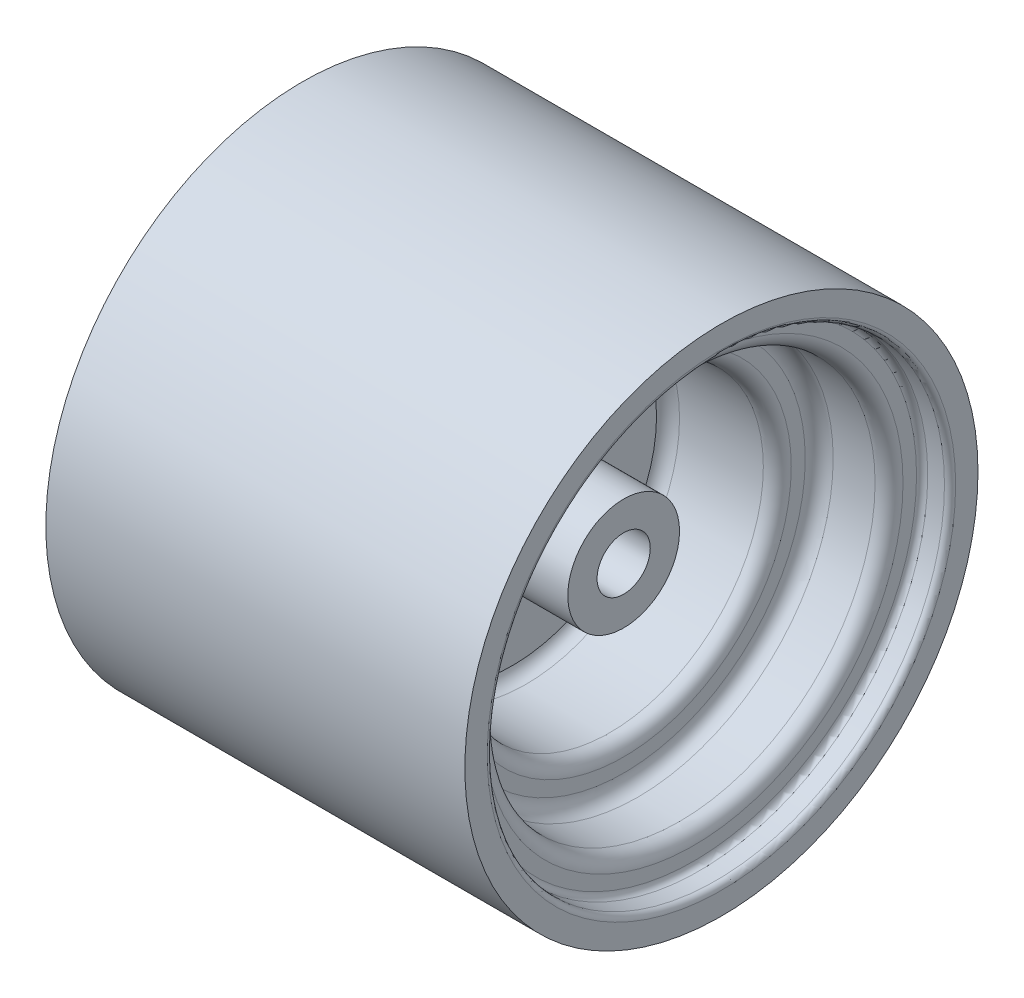
ISO-10303-21;
HEADER;
FILE_DESCRIPTION(('STEP AP214'),'2;1');
FILE_NAME('part.step','',(''),(''),'','','');
FILE_SCHEMA(('AUTOMOTIVE_DESIGN { 1 0 10303 214 1 1 1 1 }'));
ENDSEC;
DATA;
#1=APPLICATION_CONTEXT('core data for automotive mechanical design processes');
#2=APPLICATION_PROTOCOL_DEFINITION('international standard','automotive_design',2000,#1);
#3=PRODUCT_CONTEXT('',#1,'mechanical');
#4=PRODUCT('Part','Part','',(#3));
#5=PRODUCT_RELATED_PRODUCT_CATEGORY('part','',(#4));
#6=PRODUCT_DEFINITION_FORMATION('','',#4);
#7=PRODUCT_DEFINITION_CONTEXT('part definition',#1,'design');
#8=PRODUCT_DEFINITION('design','',#6,#7);
#9=PRODUCT_DEFINITION_SHAPE('','',#8);
#10=(LENGTH_UNIT() NAMED_UNIT(*) SI_UNIT(.MILLI.,.METRE.));
#11=(NAMED_UNIT(*) PLANE_ANGLE_UNIT() SI_UNIT($,.RADIAN.));
#12=(NAMED_UNIT(*) SI_UNIT($,.STERADIAN.) SOLID_ANGLE_UNIT());
#13=UNCERTAINTY_MEASURE_WITH_UNIT(LENGTH_MEASURE(1.E-05),#10,'distance_accuracy_value','');
#14=(GEOMETRIC_REPRESENTATION_CONTEXT(3) GLOBAL_UNCERTAINTY_ASSIGNED_CONTEXT((#13)) GLOBAL_UNIT_ASSIGNED_CONTEXT((#10,
#11,#12)) REPRESENTATION_CONTEXT('',''));
#15=CARTESIAN_POINT('',(0.,0.,0.));
#16=DIRECTION('',(0.,0.,1.));
#17=DIRECTION('',(1.,0.,0.));
#18=AXIS2_PLACEMENT_3D('',#15,#16,#17);
#19=CARTESIAN_POINT('',(150.24,0.,0.));
#20=DIRECTION('',(-1.,0.,0.));
#21=DIRECTION('',(0.,0.,1.));
#22=AXIS2_PLACEMENT_3D('',#19,#20,#21);
#23=CYLINDRICAL_SURFACE('',#22,91.845);
#24=CARTESIAN_POINT('',(150.24,0.,0.));
#25=DIRECTION('',(1.,0.,0.));
#26=DIRECTION('',(0.,0.,-1.));
#27=AXIS2_PLACEMENT_3D('',#24,#25,#26);
#28=CIRCLE('',#27,91.845);
#29=CARTESIAN_POINT('',(150.24,0.,-91.845));
#30=VERTEX_POINT('',#29);
#31=EDGE_CURVE('E76',#30,#30,#28,.T.);
#32=ORIENTED_EDGE('',*,*,#31,.F.);
#33=EDGE_LOOP('',(#32));
#34=FACE_BOUND('',#33,.T.);
#35=CARTESIAN_POINT('',(0.239999999999962,0.,0.));
#36=DIRECTION('',(1.,0.,0.));
#37=DIRECTION('',(0.,0.,-1.));
#38=AXIS2_PLACEMENT_3D('',#35,#36,#37);
#39=CIRCLE('',#38,91.845);
#40=CARTESIAN_POINT('',(0.239999999999962,0.,-91.845));
#41=VERTEX_POINT('',#40);
#42=EDGE_CURVE('E133',#41,#41,#39,.T.);
#43=ORIENTED_EDGE('',*,*,#42,.T.);
#44=EDGE_LOOP('',(#43));
#45=FACE_BOUND('',#44,.T.);
#46=ADVANCED_FACE('F32',(#34,#45),#23,.T.);
#47=CARTESIAN_POINT('',(150.24,0.,0.));
#48=DIRECTION('',(1.,0.,0.));
#49=DIRECTION('',(0.,0.,-1.));
#50=AXIS2_PLACEMENT_3D('',#47,#48,#49);
#51=PLANE('',#50);
#52=CARTESIAN_POINT('',(150.24,0.,0.));
#53=DIRECTION('',(1.,0.,0.));
#54=DIRECTION('',(0.,0.,-1.));
#55=AXIS2_PLACEMENT_3D('',#52,#53,#54);
#56=CIRCLE('',#55,83.845);
#57=CARTESIAN_POINT('',(150.24,0.,-83.845));
#58=VERTEX_POINT('',#57);
#59=EDGE_CURVE('E70',#58,#58,#56,.F.);
#60=ORIENTED_EDGE('',*,*,#59,.T.);
#61=EDGE_LOOP('',(#60));
#62=FACE_BOUND('',#61,.T.);
#63=ORIENTED_EDGE('',*,*,#31,.T.);
#64=EDGE_LOOP('',(#63));
#65=FACE_BOUND('',#64,.T.);
#66=ADVANCED_FACE('F165',(#62,#65),#51,.T.);
#67=CARTESIAN_POINT('',(140.24,0.,0.));
#68=DIRECTION('',(1.,0.,0.));
#69=DIRECTION('',(0.,0.,-1.));
#70=AXIS2_PLACEMENT_3D('',#67,#68,#69);
#71=CYLINDRICAL_SURFACE('',#70,81.845);
#72=CARTESIAN_POINT('',(142.24,0.,0.));
#73=DIRECTION('',(1.,0.,0.));
#74=DIRECTION('',(0.,0.,-1.));
#75=AXIS2_PLACEMENT_3D('',#72,#73,#74);
#76=CIRCLE('',#75,81.845);
#77=CARTESIAN_POINT('',(142.24,0.,-81.845));
#78=VERTEX_POINT('',#77);
#79=EDGE_CURVE('E52',#78,#78,#76,.F.);
#80=ORIENTED_EDGE('',*,*,#79,.T.);
#81=EDGE_LOOP('',(#80));
#82=FACE_BOUND('',#81,.T.);
#83=CARTESIAN_POINT('',(148.24,0.,0.));
#84=DIRECTION('',(1.,0.,0.));
#85=DIRECTION('',(0.,0.,-1.));
#86=AXIS2_PLACEMENT_3D('',#83,#84,#85);
#87=CIRCLE('',#86,81.845);
#88=CARTESIAN_POINT('',(148.24,0.,-81.845));
#89=VERTEX_POINT('',#88);
#90=EDGE_CURVE('E73',#89,#89,#87,.T.);
#91=ORIENTED_EDGE('',*,*,#90,.T.);
#92=EDGE_LOOP('',(#91));
#93=FACE_BOUND('',#92,.T.);
#94=ADVANCED_FACE('F171',(#82,#93),#71,.F.);
#95=CARTESIAN_POINT('',(140.24,0.,0.));
#96=DIRECTION('',(1.,0.,0.));
#97=DIRECTION('',(0.,0.,-1.));
#98=AXIS2_PLACEMENT_3D('',#95,#96,#97);
#99=PLANE('',#98);
#100=CARTESIAN_POINT('',(140.24,0.,0.));
#101=DIRECTION('',(1.,0.,0.));
#102=DIRECTION('',(0.,0.,-1.));
#103=AXIS2_PLACEMENT_3D('',#100,#101,#102);
#104=CIRCLE('',#103,79.845);
#105=CARTESIAN_POINT('',(140.24,0.,-79.845));
#106=VERTEX_POINT('',#105);
#107=EDGE_CURVE('E55',#106,#106,#104,.T.);
#108=ORIENTED_EDGE('',*,*,#107,.T.);
#109=EDGE_LOOP('',(#108));
#110=FACE_BOUND('',#109,.T.);
#111=CARTESIAN_POINT('',(140.24,0.,0.));
#112=DIRECTION('',(1.,0.,0.));
#113=DIRECTION('',(0.,0.,-1.));
#114=AXIS2_PLACEMENT_3D('',#111,#112,#113);
#115=CIRCLE('',#114,75.);
#116=CARTESIAN_POINT('',(140.24,0.,-75.));
#117=VERTEX_POINT('',#116);
#118=EDGE_CURVE('E64',#117,#117,#115,.F.);
#119=ORIENTED_EDGE('',*,*,#118,.T.);
#120=EDGE_LOOP('',(#119));
#121=FACE_BOUND('',#120,.T.);
#122=ADVANCED_FACE('F296',(#110,#121),#99,.T.);
#123=CARTESIAN_POINT('',(115.24,0.,0.));
#124=DIRECTION('',(1.,0.,0.));
#125=DIRECTION('',(0.,0.,-1.));
#126=AXIS2_PLACEMENT_3D('',#123,#124,#125);
#127=CYLINDRICAL_SURFACE('',#126,70.);
#128=CARTESIAN_POINT('',(120.24,0.,0.));
#129=DIRECTION('',(1.,0.,0.));
#130=DIRECTION('',(0.,0.,-1.));
#131=AXIS2_PLACEMENT_3D('',#128,#129,#130);
#132=CIRCLE('',#131,70.);
#133=CARTESIAN_POINT('',(120.24,0.,-70.));
#134=VERTEX_POINT('',#133);
#135=EDGE_CURVE('E58',#134,#134,#132,.F.);
#136=ORIENTED_EDGE('',*,*,#135,.T.);
#137=EDGE_LOOP('',(#136));
#138=FACE_BOUND('',#137,.T.);
#139=CARTESIAN_POINT('',(135.24,0.,0.));
#140=DIRECTION('',(1.,0.,0.));
#141=DIRECTION('',(0.,0.,-1.));
#142=AXIS2_PLACEMENT_3D('',#139,#140,#141);
#143=CIRCLE('',#142,70.);
#144=CARTESIAN_POINT('',(135.24,0.,-70.));
#145=VERTEX_POINT('',#144);
#146=EDGE_CURVE('E67',#145,#145,#143,.T.);
#147=ORIENTED_EDGE('',*,*,#146,.T.);
#148=EDGE_LOOP('',(#147));
#149=FACE_BOUND('',#148,.T.);
#150=ADVANCED_FACE('F292',(#138,#149),#127,.F.);
#151=CARTESIAN_POINT('',(115.24,0.,0.));
#152=DIRECTION('',(1.,0.,0.));
#153=DIRECTION('',(0.,0.,-1.));
#154=AXIS2_PLACEMENT_3D('',#151,#152,#153);
#155=PLANE('',#154);
#156=CARTESIAN_POINT('',(115.24,0.,0.));
#157=DIRECTION('',(1.,0.,0.));
#158=DIRECTION('',(0.,0.,-1.));
#159=AXIS2_PLACEMENT_3D('',#156,#157,#158);
#160=CIRCLE('',#159,60.);
#161=CARTESIAN_POINT('',(115.24,0.,-60.));
#162=VERTEX_POINT('',#161);
#163=EDGE_CURVE('E43',#162,#162,#160,.F.);
#164=ORIENTED_EDGE('',*,*,#163,.T.);
#165=EDGE_LOOP('',(#164));
#166=FACE_BOUND('',#165,.T.);
#167=CARTESIAN_POINT('',(115.24,0.,0.));
#168=DIRECTION('',(1.,0.,0.));
#169=DIRECTION('',(0.,0.,-1.));
#170=AXIS2_PLACEMENT_3D('',#167,#168,#169);
#171=CIRCLE('',#170,65.);
#172=CARTESIAN_POINT('',(115.24,0.,-65.));
#173=VERTEX_POINT('',#172);
#174=EDGE_CURVE('E61',#173,#173,#171,.T.);
#175=ORIENTED_EDGE('',*,*,#174,.T.);
#176=EDGE_LOOP('',(#175));
#177=FACE_BOUND('',#176,.T.);
#178=ADVANCED_FACE('F289',(#166,#177),#155,.T.);
#179=CARTESIAN_POINT('',(75.24,0.,0.));
#180=DIRECTION('',(1.,0.,0.));
#181=DIRECTION('',(0.,0.,-1.));
#182=AXIS2_PLACEMENT_3D('',#179,#180,#181);
#183=CYLINDRICAL_SURFACE('',#182,55.);
#184=CARTESIAN_POINT('',(80.24,0.,0.));
#185=DIRECTION('',(1.,0.,0.));
#186=DIRECTION('',(0.,0.,-1.));
#187=AXIS2_PLACEMENT_3D('',#184,#185,#186);
#188=CIRCLE('',#187,55.);
#189=CARTESIAN_POINT('',(80.24,0.,-55.));
#190=VERTEX_POINT('',#189);
#191=EDGE_CURVE('E39',#190,#190,#188,.F.);
#192=ORIENTED_EDGE('',*,*,#191,.T.);
#193=EDGE_LOOP('',(#192));
#194=FACE_BOUND('',#193,.T.);
#195=CARTESIAN_POINT('',(110.24,0.,0.));
#196=DIRECTION('',(1.,0.,0.));
#197=DIRECTION('',(0.,0.,-1.));
#198=AXIS2_PLACEMENT_3D('',#195,#196,#197);
#199=CIRCLE('',#198,55.);
#200=CARTESIAN_POINT('',(110.24,0.,-55.));
#201=VERTEX_POINT('',#200);
#202=EDGE_CURVE('E47',#201,#201,#199,.T.);
#203=ORIENTED_EDGE('',*,*,#202,.T.);
#204=EDGE_LOOP('',(#203));
#205=FACE_BOUND('',#204,.T.);
#206=ADVANCED_FACE('F182',(#194,#205),#183,.F.);
#207=CARTESIAN_POINT('',(148.24,0.,0.));
#208=DIRECTION('',(1.,0.,0.));
#209=DIRECTION('',(0.,0.,-1.));
#210=AXIS2_PLACEMENT_3D('',#207,#208,#209);
#211=TOROIDAL_SURFACE('',#210,83.845,2.);
#212=ORIENTED_EDGE('',*,*,#59,.F.);
#213=EDGE_LOOP('',(#212));
#214=FACE_BOUND('',#213,.T.);
#215=ORIENTED_EDGE('',*,*,#90,.F.);
#216=EDGE_LOOP('',(#215));
#217=FACE_BOUND('',#216,.T.);
#218=ADVANCED_FACE('F178',(#214,#217),#211,.T.);
#219=CARTESIAN_POINT('',(135.24,0.,0.));
#220=DIRECTION('',(1.,0.,0.));
#221=DIRECTION('',(0.,0.,-1.));
#222=AXIS2_PLACEMENT_3D('',#219,#220,#221);
#223=TOROIDAL_SURFACE('',#222,75.,5.);
#224=ORIENTED_EDGE('',*,*,#118,.F.);
#225=EDGE_LOOP('',(#224));
#226=FACE_BOUND('',#225,.T.);
#227=ORIENTED_EDGE('',*,*,#146,.F.);
#228=EDGE_LOOP('',(#227));
#229=FACE_BOUND('',#228,.T.);
#230=ADVANCED_FACE('F181',(#226,#229),#223,.T.);
#231=CARTESIAN_POINT('',(120.24,0.,0.));
#232=DIRECTION('',(1.,0.,0.));
#233=DIRECTION('',(0.,0.,-1.));
#234=AXIS2_PLACEMENT_3D('',#231,#232,#233);
#235=TOROIDAL_SURFACE('',#234,65.,5.);
#236=ORIENTED_EDGE('',*,*,#135,.F.);
#237=EDGE_LOOP('',(#236));
#238=FACE_BOUND('',#237,.T.);
#239=ORIENTED_EDGE('',*,*,#174,.F.);
#240=EDGE_LOOP('',(#239));
#241=FACE_BOUND('',#240,.T.);
#242=ADVANCED_FACE('F186',(#238,#241),#235,.F.);
#243=CARTESIAN_POINT('',(142.24,0.,0.));
#244=DIRECTION('',(1.,0.,0.));
#245=DIRECTION('',(0.,0.,-1.));
#246=AXIS2_PLACEMENT_3D('',#243,#244,#245);
#247=TOROIDAL_SURFACE('',#246,79.845,2.);
#248=ORIENTED_EDGE('',*,*,#79,.F.);
#249=EDGE_LOOP('',(#248));
#250=FACE_BOUND('',#249,.T.);
#251=ORIENTED_EDGE('',*,*,#107,.F.);
#252=EDGE_LOOP('',(#251));
#253=FACE_BOUND('',#252,.T.);
#254=ADVANCED_FACE('F190',(#250,#253),#247,.F.);
#255=CARTESIAN_POINT('',(110.24,0.,0.));
#256=DIRECTION('',(1.,0.,0.));
#257=DIRECTION('',(0.,0.,-1.));
#258=AXIS2_PLACEMENT_3D('',#255,#256,#257);
#259=TOROIDAL_SURFACE('',#258,60.,5.);
#260=ORIENTED_EDGE('',*,*,#163,.F.);
#261=EDGE_LOOP('',(#260));
#262=FACE_BOUND('',#261,.T.);
#263=ORIENTED_EDGE('',*,*,#202,.F.);
#264=EDGE_LOOP('',(#263));
#265=FACE_BOUND('',#264,.T.);
#266=ADVANCED_FACE('F194',(#262,#265),#259,.T.);
#267=CARTESIAN_POINT('',(80.24,0.,0.));
#268=DIRECTION('',(1.,0.,0.));
#269=DIRECTION('',(0.,0.,-1.));
#270=AXIS2_PLACEMENT_3D('',#267,#268,#269);
#271=TOROIDAL_SURFACE('',#270,50.,5.);
#272=CARTESIAN_POINT('',(75.48,0.,0.));
#273=DIRECTION('',(1.,0.,0.));
#274=DIRECTION('',(0.,0.,-1.));
#275=AXIS2_PLACEMENT_3D('',#272,#273,#274);
#276=CIRCLE('',#275,51.5304901175766);
#277=CARTESIAN_POINT('',(75.48,0.,-51.5304901175766));
#278=VERTEX_POINT('',#277);
#279=EDGE_CURVE('E91',#278,#278,#276,.F.);
#280=ORIENTED_EDGE('',*,*,#279,.T.);
#281=EDGE_LOOP('',(#280));
#282=FACE_BOUND('',#281,.T.);
#283=ORIENTED_EDGE('',*,*,#191,.F.);
#284=EDGE_LOOP('',(#283));
#285=FACE_BOUND('',#284,.T.);
#286=ADVANCED_FACE('F197',(#282,#285),#271,.F.);
#287=CARTESIAN_POINT('',(75.48,0.,0.));
#288=DIRECTION('',(1.,0.,0.));
#289=DIRECTION('',(0.,0.,1.));
#290=AXIS2_PLACEMENT_3D('',#287,#288,#289);
#291=PLANE('',#290);
#292=CARTESIAN_POINT('',(75.48,0.,0.));
#293=DIRECTION('',(-1.,0.,0.));
#294=DIRECTION('',(0.,0.,1.));
#295=AXIS2_PLACEMENT_3D('',#292,#293,#294);
#296=CIRCLE('',#295,21.050052633037);
#297=CARTESIAN_POINT('',(75.48,0.,21.050052633037));
#298=VERTEX_POINT('',#297);
#299=EDGE_CURVE('E94',#298,#298,#296,.F.);
#300=ORIENTED_EDGE('',*,*,#299,.F.);
#301=EDGE_LOOP('',(#300));
#302=FACE_BOUND('',#301,.T.);
#303=ORIENTED_EDGE('',*,*,#279,.F.);
#304=EDGE_LOOP('',(#303));
#305=FACE_BOUND('',#304,.T.);
#306=ADVANCED_FACE('F200',(#302,#305),#291,.T.);
#307=CARTESIAN_POINT('',(0.239999999999962,0.,0.));
#308=DIRECTION('',(-1.,0.,0.));
#309=DIRECTION('',(0.,0.,-1.));
#310=AXIS2_PLACEMENT_3D('',#307,#308,#309);
#311=PLANE('',#310);
#312=CARTESIAN_POINT('',(0.239999999999962,0.,0.));
#313=DIRECTION('',(1.,0.,0.));
#314=DIRECTION('',(0.,0.,-1.));
#315=AXIS2_PLACEMENT_3D('',#312,#313,#314);
#316=CIRCLE('',#315,83.845);
#317=CARTESIAN_POINT('',(0.239999999999962,0.,-83.845));
#318=VERTEX_POINT('',#317);
#319=EDGE_CURVE('E127',#318,#318,#316,.F.);
#320=ORIENTED_EDGE('',*,*,#319,.F.);
#321=EDGE_LOOP('',(#320));
#322=FACE_BOUND('',#321,.T.);
#323=ORIENTED_EDGE('',*,*,#42,.F.);
#324=EDGE_LOOP('',(#323));
#325=FACE_BOUND('',#324,.T.);
#326=ADVANCED_FACE('F205',(#322,#325),#311,.T.);
#327=CARTESIAN_POINT('',(10.24,0.,0.));
#328=DIRECTION('',(-1.,0.,0.));
#329=DIRECTION('',(0.,0.,-1.));
#330=AXIS2_PLACEMENT_3D('',#327,#328,#329);
#331=CYLINDRICAL_SURFACE('',#330,81.845);
#332=CARTESIAN_POINT('',(8.23999999999997,0.,0.));
#333=DIRECTION('',(1.,0.,0.));
#334=DIRECTION('',(0.,0.,-1.));
#335=AXIS2_PLACEMENT_3D('',#332,#333,#334);
#336=CIRCLE('',#335,81.845);
#337=CARTESIAN_POINT('',(8.23999999999997,0.,-81.845));
#338=VERTEX_POINT('',#337);
#339=EDGE_CURVE('E109',#338,#338,#336,.F.);
#340=ORIENTED_EDGE('',*,*,#339,.F.);
#341=EDGE_LOOP('',(#340));
#342=FACE_BOUND('',#341,.T.);
#343=CARTESIAN_POINT('',(2.23999999999996,0.,0.));
#344=DIRECTION('',(1.,0.,0.));
#345=DIRECTION('',(0.,0.,-1.));
#346=AXIS2_PLACEMENT_3D('',#343,#344,#345);
#347=CIRCLE('',#346,81.845);
#348=CARTESIAN_POINT('',(2.23999999999996,0.,-81.845));
#349=VERTEX_POINT('',#348);
#350=EDGE_CURVE('E130',#349,#349,#347,.T.);
#351=ORIENTED_EDGE('',*,*,#350,.F.);
#352=EDGE_LOOP('',(#351));
#353=FACE_BOUND('',#352,.T.);
#354=ADVANCED_FACE('F214',(#342,#353),#331,.F.);
#355=CARTESIAN_POINT('',(10.24,0.,0.));
#356=DIRECTION('',(-1.,0.,0.));
#357=DIRECTION('',(0.,0.,-1.));
#358=AXIS2_PLACEMENT_3D('',#355,#356,#357);
#359=PLANE('',#358);
#360=CARTESIAN_POINT('',(10.24,0.,0.));
#361=DIRECTION('',(1.,0.,0.));
#362=DIRECTION('',(0.,0.,-1.));
#363=AXIS2_PLACEMENT_3D('',#360,#361,#362);
#364=CIRCLE('',#363,79.845);
#365=CARTESIAN_POINT('',(10.24,0.,-79.845));
#366=VERTEX_POINT('',#365);
#367=EDGE_CURVE('E112',#366,#366,#364,.T.);
#368=ORIENTED_EDGE('',*,*,#367,.F.);
#369=EDGE_LOOP('',(#368));
#370=FACE_BOUND('',#369,.T.);
#371=CARTESIAN_POINT('',(10.24,0.,0.));
#372=DIRECTION('',(1.,0.,0.));
#373=DIRECTION('',(0.,0.,-1.));
#374=AXIS2_PLACEMENT_3D('',#371,#372,#373);
#375=CIRCLE('',#374,75.);
#376=CARTESIAN_POINT('',(10.24,0.,-75.));
#377=VERTEX_POINT('',#376);
#378=EDGE_CURVE('E121',#377,#377,#375,.F.);
#379=ORIENTED_EDGE('',*,*,#378,.F.);
#380=EDGE_LOOP('',(#379));
#381=FACE_BOUND('',#380,.T.);
#382=ADVANCED_FACE('F238',(#370,#381),#359,.T.);
#383=CARTESIAN_POINT('',(35.24,0.,0.));
#384=DIRECTION('',(-1.,0.,0.));
#385=DIRECTION('',(0.,0.,-1.));
#386=AXIS2_PLACEMENT_3D('',#383,#384,#385);
#387=CYLINDRICAL_SURFACE('',#386,70.);
#388=CARTESIAN_POINT('',(30.24,0.,0.));
#389=DIRECTION('',(1.,0.,0.));
#390=DIRECTION('',(0.,0.,-1.));
#391=AXIS2_PLACEMENT_3D('',#388,#389,#390);
#392=CIRCLE('',#391,70.);
#393=CARTESIAN_POINT('',(30.24,0.,-70.));
#394=VERTEX_POINT('',#393);
#395=EDGE_CURVE('E115',#394,#394,#392,.F.);
#396=ORIENTED_EDGE('',*,*,#395,.F.);
#397=EDGE_LOOP('',(#396));
#398=FACE_BOUND('',#397,.T.);
#399=CARTESIAN_POINT('',(15.24,0.,0.));
#400=DIRECTION('',(1.,0.,0.));
#401=DIRECTION('',(0.,0.,-1.));
#402=AXIS2_PLACEMENT_3D('',#399,#400,#401);
#403=CIRCLE('',#402,70.);
#404=CARTESIAN_POINT('',(15.24,0.,-70.));
#405=VERTEX_POINT('',#404);
#406=EDGE_CURVE('E124',#405,#405,#403,.T.);
#407=ORIENTED_EDGE('',*,*,#406,.F.);
#408=EDGE_LOOP('',(#407));
#409=FACE_BOUND('',#408,.T.);
#410=ADVANCED_FACE('F234',(#398,#409),#387,.F.);
#411=CARTESIAN_POINT('',(35.24,0.,0.));
#412=DIRECTION('',(-1.,0.,0.));
#413=DIRECTION('',(0.,0.,-1.));
#414=AXIS2_PLACEMENT_3D('',#411,#412,#413);
#415=PLANE('',#414);
#416=CARTESIAN_POINT('',(35.24,0.,0.));
#417=DIRECTION('',(1.,0.,0.));
#418=DIRECTION('',(0.,0.,-1.));
#419=AXIS2_PLACEMENT_3D('',#416,#417,#418);
#420=CIRCLE('',#419,60.);
#421=CARTESIAN_POINT('',(35.24,0.,-60.));
#422=VERTEX_POINT('',#421);
#423=EDGE_CURVE('E103',#422,#422,#420,.F.);
#424=ORIENTED_EDGE('',*,*,#423,.F.);
#425=EDGE_LOOP('',(#424));
#426=FACE_BOUND('',#425,.T.);
#427=CARTESIAN_POINT('',(35.24,0.,0.));
#428=DIRECTION('',(1.,0.,0.));
#429=DIRECTION('',(0.,0.,-1.));
#430=AXIS2_PLACEMENT_3D('',#427,#428,#429);
#431=CIRCLE('',#430,65.);
#432=CARTESIAN_POINT('',(35.24,0.,-65.));
#433=VERTEX_POINT('',#432);
#434=EDGE_CURVE('E118',#433,#433,#431,.T.);
#435=ORIENTED_EDGE('',*,*,#434,.F.);
#436=EDGE_LOOP('',(#435));
#437=FACE_BOUND('',#436,.T.);
#438=ADVANCED_FACE('F230',(#426,#437),#415,.T.);
#439=CARTESIAN_POINT('',(75.24,0.,0.));
#440=DIRECTION('',(-1.,0.,0.));
#441=DIRECTION('',(0.,0.,-1.));
#442=AXIS2_PLACEMENT_3D('',#439,#440,#441);
#443=CYLINDRICAL_SURFACE('',#442,55.);
#444=CARTESIAN_POINT('',(70.24,0.,0.));
#445=DIRECTION('',(1.,0.,0.));
#446=DIRECTION('',(0.,0.,-1.));
#447=AXIS2_PLACEMENT_3D('',#444,#445,#446);
#448=CIRCLE('',#447,55.);
#449=CARTESIAN_POINT('',(70.24,0.,-55.));
#450=VERTEX_POINT('',#449);
#451=EDGE_CURVE('E100',#450,#450,#448,.F.);
#452=ORIENTED_EDGE('',*,*,#451,.F.);
#453=EDGE_LOOP('',(#452));
#454=FACE_BOUND('',#453,.T.);
#455=CARTESIAN_POINT('',(40.24,0.,0.));
#456=DIRECTION('',(1.,0.,0.));
#457=DIRECTION('',(0.,0.,-1.));
#458=AXIS2_PLACEMENT_3D('',#455,#456,#457);
#459=CIRCLE('',#458,55.);
#460=CARTESIAN_POINT('',(40.24,0.,-55.));
#461=VERTEX_POINT('',#460);
#462=EDGE_CURVE('E106',#461,#461,#459,.T.);
#463=ORIENTED_EDGE('',*,*,#462,.F.);
#464=EDGE_LOOP('',(#463));
#465=FACE_BOUND('',#464,.T.);
#466=ADVANCED_FACE('F226',(#454,#465),#443,.F.);
#467=CARTESIAN_POINT('',(2.23999999999996,0.,0.));
#468=DIRECTION('',(-1.,0.,0.));
#469=DIRECTION('',(0.,0.,-1.));
#470=AXIS2_PLACEMENT_3D('',#467,#468,#469);
#471=TOROIDAL_SURFACE('',#470,83.845,2.);
#472=ORIENTED_EDGE('',*,*,#319,.T.);
#473=EDGE_LOOP('',(#472));
#474=FACE_BOUND('',#473,.T.);
#475=ORIENTED_EDGE('',*,*,#350,.T.);
#476=EDGE_LOOP('',(#475));
#477=FACE_BOUND('',#476,.T.);
#478=ADVANCED_FACE('F229',(#474,#477),#471,.T.);
#479=CARTESIAN_POINT('',(15.24,0.,0.));
#480=DIRECTION('',(-1.,0.,0.));
#481=DIRECTION('',(0.,0.,-1.));
#482=AXIS2_PLACEMENT_3D('',#479,#480,#481);
#483=TOROIDAL_SURFACE('',#482,75.,5.);
#484=ORIENTED_EDGE('',*,*,#378,.T.);
#485=EDGE_LOOP('',(#484));
#486=FACE_BOUND('',#485,.T.);
#487=ORIENTED_EDGE('',*,*,#406,.T.);
#488=EDGE_LOOP('',(#487));
#489=FACE_BOUND('',#488,.T.);
#490=ADVANCED_FACE('F248',(#486,#489),#483,.T.);
#491=CARTESIAN_POINT('',(30.24,0.,0.));
#492=DIRECTION('',(-1.,0.,0.));
#493=DIRECTION('',(0.,0.,-1.));
#494=AXIS2_PLACEMENT_3D('',#491,#492,#493);
#495=TOROIDAL_SURFACE('',#494,65.,5.);
#496=ORIENTED_EDGE('',*,*,#395,.T.);
#497=EDGE_LOOP('',(#496));
#498=FACE_BOUND('',#497,.T.);
#499=ORIENTED_EDGE('',*,*,#434,.T.);
#500=EDGE_LOOP('',(#499));
#501=FACE_BOUND('',#500,.T.);
#502=ADVANCED_FACE('F252',(#498,#501),#495,.F.);
#503=CARTESIAN_POINT('',(8.23999999999997,0.,0.));
#504=DIRECTION('',(-1.,0.,0.));
#505=DIRECTION('',(0.,0.,-1.));
#506=AXIS2_PLACEMENT_3D('',#503,#504,#505);
#507=TOROIDAL_SURFACE('',#506,79.845,2.);
#508=ORIENTED_EDGE('',*,*,#339,.T.);
#509=EDGE_LOOP('',(#508));
#510=FACE_BOUND('',#509,.T.);
#511=ORIENTED_EDGE('',*,*,#367,.T.);
#512=EDGE_LOOP('',(#511));
#513=FACE_BOUND('',#512,.T.);
#514=ADVANCED_FACE('F256',(#510,#513),#507,.F.);
#515=CARTESIAN_POINT('',(40.24,0.,0.));
#516=DIRECTION('',(-1.,0.,0.));
#517=DIRECTION('',(0.,0.,-1.));
#518=AXIS2_PLACEMENT_3D('',#515,#516,#517);
#519=TOROIDAL_SURFACE('',#518,60.,5.);
#520=ORIENTED_EDGE('',*,*,#423,.T.);
#521=EDGE_LOOP('',(#520));
#522=FACE_BOUND('',#521,.T.);
#523=ORIENTED_EDGE('',*,*,#462,.T.);
#524=EDGE_LOOP('',(#523));
#525=FACE_BOUND('',#524,.T.);
#526=ADVANCED_FACE('F159',(#522,#525),#519,.T.);
#527=CARTESIAN_POINT('',(70.24,0.,0.));
#528=DIRECTION('',(-1.,0.,0.));
#529=DIRECTION('',(0.,0.,-1.));
#530=AXIS2_PLACEMENT_3D('',#527,#528,#529);
#531=TOROIDAL_SURFACE('',#530,50.,5.);
#532=CARTESIAN_POINT('',(75.,0.,0.));
#533=DIRECTION('',(-1.,0.,0.));
#534=DIRECTION('',(0.,0.,1.));
#535=AXIS2_PLACEMENT_3D('',#532,#533,#534);
#536=CIRCLE('',#535,51.5304901175766);
#537=CARTESIAN_POINT('',(75.,0.,51.5304901175766));
#538=VERTEX_POINT('',#537);
#539=EDGE_CURVE('E85',#538,#538,#536,.T.);
#540=ORIENTED_EDGE('',*,*,#539,.F.);
#541=EDGE_LOOP('',(#540));
#542=FACE_BOUND('',#541,.T.);
#543=ORIENTED_EDGE('',*,*,#451,.T.);
#544=EDGE_LOOP('',(#543));
#545=FACE_BOUND('',#544,.T.);
#546=ADVANCED_FACE('F149',(#542,#545),#531,.F.);
#547=CARTESIAN_POINT('',(40.24,0.,0.));
#548=DIRECTION('',(1.,0.,0.));
#549=DIRECTION('',(0.,0.,-1.));
#550=AXIS2_PLACEMENT_3D('',#547,#548,#549);
#551=CYLINDRICAL_SURFACE('',#550,9.525);
#552=CARTESIAN_POINT('',(115.24,0.,0.));
#553=DIRECTION('',(1.,0.,0.));
#554=DIRECTION('',(0.,0.,-1.));
#555=AXIS2_PLACEMENT_3D('',#552,#553,#554);
#556=CIRCLE('',#555,9.525);
#557=CARTESIAN_POINT('',(115.24,0.,-9.525));
#558=VERTEX_POINT('',#557);
#559=EDGE_CURVE('E82',#558,#558,#556,.T.);
#560=ORIENTED_EDGE('',*,*,#559,.T.);
#561=EDGE_LOOP('',(#560));
#562=FACE_BOUND('',#561,.T.);
#563=CARTESIAN_POINT('',(35.24,0.,0.));
#564=DIRECTION('',(1.,0.,0.));
#565=DIRECTION('',(0.,0.,-1.));
#566=AXIS2_PLACEMENT_3D('',#563,#564,#565);
#567=CIRCLE('',#566,9.525);
#568=CARTESIAN_POINT('',(35.24,0.,-9.525));
#569=VERTEX_POINT('',#568);
#570=EDGE_CURVE('E139',#569,#569,#567,.T.);
#571=ORIENTED_EDGE('',*,*,#570,.F.);
#572=EDGE_LOOP('',(#571));
#573=FACE_BOUND('',#572,.T.);
#574=ADVANCED_FACE('F146',(#562,#573),#551,.F.);
#575=CARTESIAN_POINT('',(115.24,0.,0.));
#576=DIRECTION('',(1.,0.,0.));
#577=DIRECTION('',(0.,0.,-1.));
#578=AXIS2_PLACEMENT_3D('',#575,#576,#577);
#579=PLANE('',#578);
#580=ORIENTED_EDGE('',*,*,#559,.F.);
#581=EDGE_LOOP('',(#580));
#582=FACE_BOUND('',#581,.T.);
#583=CARTESIAN_POINT('',(115.24,0.,0.));
#584=DIRECTION('',(1.,0.,0.));
#585=DIRECTION('',(0.,0.,-1.));
#586=AXIS2_PLACEMENT_3D('',#583,#584,#585);
#587=CIRCLE('',#586,20.);
#588=CARTESIAN_POINT('',(115.24,0.,-20.));
#589=VERTEX_POINT('',#588);
#590=EDGE_CURVE('E79',#589,#589,#587,.T.);
#591=ORIENTED_EDGE('',*,*,#590,.T.);
#592=EDGE_LOOP('',(#591));
#593=FACE_BOUND('',#592,.T.);
#594=ADVANCED_FACE('F148',(#582,#593),#579,.T.);
#595=CARTESIAN_POINT('',(115.24,0.,0.));
#596=DIRECTION('',(-1.,0.,0.));
#597=DIRECTION('',(0.,0.,1.));
#598=AXIS2_PLACEMENT_3D('',#595,#596,#597);
#599=CYLINDRICAL_SURFACE('',#598,20.);
#600=CARTESIAN_POINT('',(77.24,0.,0.));
#601=DIRECTION('',(1.,0.,0.));
#602=DIRECTION('',(0.,0.,-1.));
#603=AXIS2_PLACEMENT_3D('',#600,#601,#602);
#604=CIRCLE('',#603,20.);
#605=CARTESIAN_POINT('',(77.24,0.,-20.));
#606=VERTEX_POINT('',#605);
#607=EDGE_CURVE('E10',#606,#606,#604,.T.);
#608=ORIENTED_EDGE('',*,*,#607,.T.);
#609=EDGE_LOOP('',(#608));
#610=FACE_BOUND('',#609,.T.);
#611=ORIENTED_EDGE('',*,*,#590,.F.);
#612=EDGE_LOOP('',(#611));
#613=FACE_BOUND('',#612,.T.);
#614=ADVANCED_FACE('F156',(#610,#613),#599,.T.);
#615=CARTESIAN_POINT('',(77.24,0.,0.));
#616=DIRECTION('',(1.,0.,0.));
#617=DIRECTION('',(0.,0.,-1.));
#618=AXIS2_PLACEMENT_3D('',#615,#616,#617);
#619=TOROIDAL_SURFACE('',#618,22.,2.);
#620=ORIENTED_EDGE('',*,*,#299,.T.);
#621=EDGE_LOOP('',(#620));
#622=FACE_BOUND('',#621,.T.);
#623=ORIENTED_EDGE('',*,*,#607,.F.);
#624=EDGE_LOOP('',(#623));
#625=FACE_BOUND('',#624,.T.);
#626=ADVANCED_FACE('F34',(#622,#625),#619,.F.);
#627=CARTESIAN_POINT('',(35.24,0.,0.));
#628=DIRECTION('',(-1.,0.,0.));
#629=DIRECTION('',(0.,0.,-1.));
#630=AXIS2_PLACEMENT_3D('',#627,#628,#629);
#631=PLANE('',#630);
#632=ORIENTED_EDGE('',*,*,#570,.T.);
#633=EDGE_LOOP('',(#632));
#634=FACE_BOUND('',#633,.T.);
#635=CARTESIAN_POINT('',(35.24,0.,0.));
#636=DIRECTION('',(1.,0.,0.));
#637=DIRECTION('',(0.,0.,-1.));
#638=AXIS2_PLACEMENT_3D('',#635,#636,#637);
#639=CIRCLE('',#638,20.);
#640=CARTESIAN_POINT('',(35.24,0.,-20.));
#641=VERTEX_POINT('',#640);
#642=EDGE_CURVE('E136',#641,#641,#639,.T.);
#643=ORIENTED_EDGE('',*,*,#642,.F.);
#644=EDGE_LOOP('',(#643));
#645=FACE_BOUND('',#644,.T.);
#646=ADVANCED_FACE('F143',(#634,#645),#631,.T.);
#647=CARTESIAN_POINT('',(35.24,0.,0.));
#648=DIRECTION('',(1.,0.,0.));
#649=DIRECTION('',(0.,0.,1.));
#650=AXIS2_PLACEMENT_3D('',#647,#648,#649);
#651=CYLINDRICAL_SURFACE('',#650,20.);
#652=CARTESIAN_POINT('',(73.24,0.,0.));
#653=DIRECTION('',(1.,0.,0.));
#654=DIRECTION('',(0.,0.,-1.));
#655=AXIS2_PLACEMENT_3D('',#652,#653,#654);
#656=CIRCLE('',#655,20.);
#657=CARTESIAN_POINT('',(73.24,0.,-20.));
#658=VERTEX_POINT('',#657);
#659=EDGE_CURVE('E97',#658,#658,#656,.T.);
#660=ORIENTED_EDGE('',*,*,#659,.F.);
#661=EDGE_LOOP('',(#660));
#662=FACE_BOUND('',#661,.T.);
#663=ORIENTED_EDGE('',*,*,#642,.T.);
#664=EDGE_LOOP('',(#663));
#665=FACE_BOUND('',#664,.T.);
#666=ADVANCED_FACE('F221',(#662,#665),#651,.T.);
#667=CARTESIAN_POINT('',(73.24,0.,0.));
#668=DIRECTION('',(-1.,0.,0.));
#669=DIRECTION('',(0.,0.,-1.));
#670=AXIS2_PLACEMENT_3D('',#667,#668,#669);
#671=TOROIDAL_SURFACE('',#670,22.,2.);
#672=CARTESIAN_POINT('',(75.,0.,0.));
#673=DIRECTION('',(1.,0.,0.));
#674=DIRECTION('',(0.,0.,-1.));
#675=AXIS2_PLACEMENT_3D('',#672,#673,#674);
#676=CIRCLE('',#675,21.050052633037);
#677=CARTESIAN_POINT('',(75.,0.,-21.050052633037));
#678=VERTEX_POINT('',#677);
#679=EDGE_CURVE('E88',#678,#678,#676,.T.);
#680=ORIENTED_EDGE('',*,*,#679,.F.);
#681=EDGE_LOOP('',(#680));
#682=FACE_BOUND('',#681,.T.);
#683=ORIENTED_EDGE('',*,*,#659,.T.);
#684=EDGE_LOOP('',(#683));
#685=FACE_BOUND('',#684,.T.);
#686=ADVANCED_FACE('F224',(#682,#685),#671,.F.);
#687=CARTESIAN_POINT('',(75.,0.,0.));
#688=DIRECTION('',(-1.,0.,0.));
#689=DIRECTION('',(0.,0.,1.));
#690=AXIS2_PLACEMENT_3D('',#687,#688,#689);
#691=PLANE('',#690);
#692=ORIENTED_EDGE('',*,*,#679,.T.);
#693=EDGE_LOOP('',(#692));
#694=FACE_BOUND('',#693,.T.);
#695=ORIENTED_EDGE('',*,*,#539,.T.);
#696=EDGE_LOOP('',(#695));
#697=FACE_BOUND('',#696,.T.);
#698=ADVANCED_FACE('F264',(#694,#697),#691,.T.);
#699=CLOSED_SHELL('',(#46,#66,#94,#122,#150,#178,#206,#218,#230,#242,#254,#266,#286,#306,#326,
#354,#382,#410,#438,#466,#478,#490,#502,#514,#526,#546,#574,#594,#614,#626,#646,#666,#686,#698));
#700=MANIFOLD_SOLID_BREP('B2',#699);
#701=ADVANCED_BREP_SHAPE_REPRESENTATION('',(#18,#700),#14);
#702=SHAPE_DEFINITION_REPRESENTATION(#9,#701);
ENDSEC;
END-ISO-10303-21;
